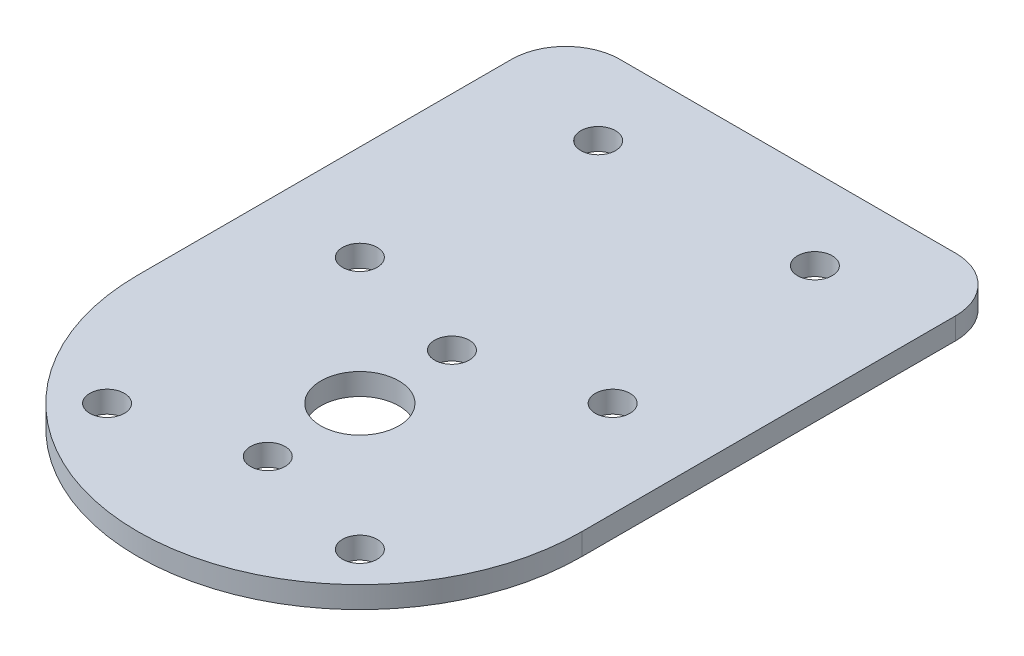
ISO-10303-21;
HEADER;
FILE_DESCRIPTION(('STEP AP214'),'2;1');
FILE_NAME('part.step','',(''),(''),'','','');
FILE_SCHEMA(('AUTOMOTIVE_DESIGN { 1 0 10303 214 1 1 1 1 }'));
ENDSEC;
DATA;
#1=APPLICATION_CONTEXT('core data for automotive mechanical design processes');
#2=APPLICATION_PROTOCOL_DEFINITION('international standard','automotive_design',2000,#1);
#3=PRODUCT_CONTEXT('',#1,'mechanical');
#4=PRODUCT('Part','Part','',(#3));
#5=PRODUCT_RELATED_PRODUCT_CATEGORY('part','',(#4));
#6=PRODUCT_DEFINITION_FORMATION('','',#4);
#7=PRODUCT_DEFINITION_CONTEXT('part definition',#1,'design');
#8=PRODUCT_DEFINITION('design','',#6,#7);
#9=PRODUCT_DEFINITION_SHAPE('','',#8);
#10=(LENGTH_UNIT() NAMED_UNIT(*) SI_UNIT(.MILLI.,.METRE.));
#11=(NAMED_UNIT(*) PLANE_ANGLE_UNIT() SI_UNIT($,.RADIAN.));
#12=(NAMED_UNIT(*) SI_UNIT($,.STERADIAN.) SOLID_ANGLE_UNIT());
#13=UNCERTAINTY_MEASURE_WITH_UNIT(LENGTH_MEASURE(1.E-05),#10,'distance_accuracy_value','');
#14=(GEOMETRIC_REPRESENTATION_CONTEXT(3) GLOBAL_UNCERTAINTY_ASSIGNED_CONTEXT((#13)) GLOBAL_UNIT_ASSIGNED_CONTEXT((#10,
#11,#12)) REPRESENTATION_CONTEXT('',''));
#15=CARTESIAN_POINT('',(0.,0.,0.));
#16=DIRECTION('',(0.,0.,1.));
#17=DIRECTION('',(1.,0.,0.));
#18=AXIS2_PLACEMENT_3D('',#15,#16,#17);
#19=CARTESIAN_POINT('',(-20.5,2.,0.));
#20=DIRECTION('',(-1.,0.,0.));
#21=DIRECTION('',(0.,0.,1.));
#22=AXIS2_PLACEMENT_3D('',#19,#20,#21);
#23=PLANE('',#22);
#24=DIRECTION('',(0.,0.,-1.));
#25=VECTOR('',#24,1.);
#26=CARTESIAN_POINT('',(-20.5,2.,0.));
#27=LINE('',#26,#25);
#28=CARTESIAN_POINT('',(-20.5,2.,0.));
#29=VERTEX_POINT('',#28);
#30=CARTESIAN_POINT('',(-20.5,2.,-34.5));
#31=VERTEX_POINT('',#30);
#32=EDGE_CURVE('E104',#29,#31,#27,.T.);
#33=ORIENTED_EDGE('',*,*,#32,.T.);
#34=DIRECTION('',(0.,-1.,0.));
#35=VECTOR('',#34,1.);
#36=CARTESIAN_POINT('',(-20.5,0.,-34.5));
#37=LINE('',#36,#35);
#38=CARTESIAN_POINT('',(-20.5,0.,-34.5));
#39=VERTEX_POINT('',#38);
#40=EDGE_CURVE('E11',#31,#39,#37,.T.);
#41=ORIENTED_EDGE('',*,*,#40,.T.);
#42=DIRECTION('',(0.,0.,-1.));
#43=VECTOR('',#42,1.);
#44=CARTESIAN_POINT('',(-20.5,0.,0.));
#45=LINE('',#44,#43);
#46=CARTESIAN_POINT('',(-20.5,0.,0.));
#47=VERTEX_POINT('',#46);
#48=EDGE_CURVE('E107',#47,#39,#45,.T.);
#49=ORIENTED_EDGE('',*,*,#48,.F.);
#50=DIRECTION('',(0.,-1.,0.));
#51=VECTOR('',#50,1.);
#52=CARTESIAN_POINT('',(-20.5,2.,0.));
#53=LINE('',#52,#51);
#54=EDGE_CURVE('E102',#29,#47,#53,.T.);
#55=ORIENTED_EDGE('',*,*,#54,.F.);
#56=EDGE_LOOP('',(#33,#41,#49,#55));
#57=FACE_BOUND('',#56,.T.);
#58=ADVANCED_FACE('F46',(#57),#23,.T.);
#59=CARTESIAN_POINT('',(0.,2.,0.));
#60=DIRECTION('',(0.,-1.,0.));
#61=DIRECTION('',(0.,0.,-1.));
#62=AXIS2_PLACEMENT_3D('',#59,#60,#61);
#63=CYLINDRICAL_SURFACE('',#62,20.5);
#64=CARTESIAN_POINT('',(0.,0.,0.));
#65=DIRECTION('',(0.,1.,0.));
#66=DIRECTION('',(0.,0.,1.));
#67=AXIS2_PLACEMENT_3D('',#64,#65,#66);
#68=CIRCLE('',#67,20.5);
#69=CARTESIAN_POINT('',(20.5,0.,0.));
#70=VERTEX_POINT('',#69);
#71=EDGE_CURVE('E177',#47,#70,#68,.T.);
#72=ORIENTED_EDGE('',*,*,#71,.T.);
#73=DIRECTION('',(0.,-1.,0.));
#74=VECTOR('',#73,1.);
#75=CARTESIAN_POINT('',(20.5,2.,0.));
#76=LINE('',#75,#74);
#77=CARTESIAN_POINT('',(20.5,2.,0.));
#78=VERTEX_POINT('',#77);
#79=EDGE_CURVE('E113',#78,#70,#76,.T.);
#80=ORIENTED_EDGE('',*,*,#79,.F.);
#81=CARTESIAN_POINT('',(0.,2.,0.));
#82=DIRECTION('',(0.,1.,0.));
#83=DIRECTION('',(0.,0.,1.));
#84=AXIS2_PLACEMENT_3D('',#81,#82,#83);
#85=CIRCLE('',#84,20.5);
#86=EDGE_CURVE('E117',#29,#78,#85,.T.);
#87=ORIENTED_EDGE('',*,*,#86,.F.);
#88=ORIENTED_EDGE('',*,*,#54,.T.);
#89=EDGE_LOOP('',(#72,#80,#87,#88));
#90=FACE_BOUND('',#89,.T.);
#91=ADVANCED_FACE('F118',(#90),#63,.T.);
#92=CARTESIAN_POINT('',(20.5,2.,0.));
#93=DIRECTION('',(-1.,0.,0.));
#94=DIRECTION('',(0.,0.,1.));
#95=AXIS2_PLACEMENT_3D('',#92,#93,#94);
#96=PLANE('',#95);
#97=DIRECTION('',(0.,0.,-1.));
#98=VECTOR('',#97,1.);
#99=CARTESIAN_POINT('',(20.5,0.,0.));
#100=LINE('',#99,#98);
#101=CARTESIAN_POINT('',(20.5,0.,-34.5));
#102=VERTEX_POINT('',#101);
#103=EDGE_CURVE('E180',#70,#102,#100,.T.);
#104=ORIENTED_EDGE('',*,*,#103,.T.);
#105=DIRECTION('',(0.,-1.,0.));
#106=VECTOR('',#105,1.);
#107=CARTESIAN_POINT('',(20.5,2.,-34.5));
#108=LINE('',#107,#106);
#109=CARTESIAN_POINT('',(20.5,2.,-34.5));
#110=VERTEX_POINT('',#109);
#111=EDGE_CURVE('E70',#102,#110,#108,.F.);
#112=ORIENTED_EDGE('',*,*,#111,.T.);
#113=DIRECTION('',(0.,0.,-1.));
#114=VECTOR('',#113,1.);
#115=CARTESIAN_POINT('',(20.5,2.,0.));
#116=LINE('',#115,#114);
#117=EDGE_CURVE('E121',#78,#110,#116,.T.);
#118=ORIENTED_EDGE('',*,*,#117,.F.);
#119=ORIENTED_EDGE('',*,*,#79,.T.);
#120=EDGE_LOOP('',(#104,#112,#118,#119));
#121=FACE_BOUND('',#120,.T.);
#122=ADVANCED_FACE('F245',(#121),#96,.F.);
#123=CARTESIAN_POINT('',(0.,2.,-8.5));
#124=DIRECTION('',(0.,-1.,0.));
#125=DIRECTION('',(0.,0.,-1.));
#126=AXIS2_PLACEMENT_3D('',#123,#124,#125);
#127=CYLINDRICAL_SURFACE('',#126,1.6);
#128=CARTESIAN_POINT('',(0.,2.,-8.5));
#129=DIRECTION('',(0.,1.,0.));
#130=DIRECTION('',(0.,0.,1.));
#131=AXIS2_PLACEMENT_3D('',#128,#129,#130);
#132=CIRCLE('',#131,1.6);
#133=CARTESIAN_POINT('',(0.,2.,-6.9));
#134=VERTEX_POINT('',#133);
#135=EDGE_CURVE('E159',#134,#134,#132,.T.);
#136=ORIENTED_EDGE('',*,*,#135,.T.);
#137=EDGE_LOOP('',(#136));
#138=FACE_BOUND('',#137,.T.);
#139=CARTESIAN_POINT('',(0.,0.,-8.5));
#140=DIRECTION('',(0.,1.,0.));
#141=DIRECTION('',(0.,0.,1.));
#142=AXIS2_PLACEMENT_3D('',#139,#140,#141);
#143=CIRCLE('',#142,1.6);
#144=CARTESIAN_POINT('',(0.,0.,-6.9));
#145=VERTEX_POINT('',#144);
#146=EDGE_CURVE('E207',#145,#145,#143,.T.);
#147=ORIENTED_EDGE('',*,*,#146,.F.);
#148=EDGE_LOOP('',(#147));
#149=FACE_BOUND('',#148,.T.);
#150=ADVANCED_FACE('F289',(#138,#149),#127,.F.);
#151=CARTESIAN_POINT('',(0.,2.,8.5));
#152=DIRECTION('',(0.,-1.,0.));
#153=DIRECTION('',(0.,0.,-1.));
#154=AXIS2_PLACEMENT_3D('',#151,#152,#153);
#155=CYLINDRICAL_SURFACE('',#154,1.6);
#156=CARTESIAN_POINT('',(0.,2.,8.5));
#157=DIRECTION('',(0.,1.,0.));
#158=DIRECTION('',(0.,0.,1.));
#159=AXIS2_PLACEMENT_3D('',#156,#157,#158);
#160=CIRCLE('',#159,1.6);
#161=CARTESIAN_POINT('',(0.,2.,10.1));
#162=VERTEX_POINT('',#161);
#163=EDGE_CURVE('E155',#162,#162,#160,.T.);
#164=ORIENTED_EDGE('',*,*,#163,.T.);
#165=EDGE_LOOP('',(#164));
#166=FACE_BOUND('',#165,.T.);
#167=CARTESIAN_POINT('',(0.,0.,8.5));
#168=DIRECTION('',(0.,1.,0.));
#169=DIRECTION('',(0.,0.,1.));
#170=AXIS2_PLACEMENT_3D('',#167,#168,#169);
#171=CIRCLE('',#170,1.6);
#172=CARTESIAN_POINT('',(0.,0.,10.1));
#173=VERTEX_POINT('',#172);
#174=EDGE_CURVE('E203',#173,#173,#171,.T.);
#175=ORIENTED_EDGE('',*,*,#174,.F.);
#176=EDGE_LOOP('',(#175));
#177=FACE_BOUND('',#176,.T.);
#178=ADVANCED_FACE('F292',(#166,#177),#155,.F.);
#179=CARTESIAN_POINT('',(-11.6672618895781,2.,11.667261889578));
#180=DIRECTION('',(0.,-1.,0.));
#181=DIRECTION('',(0.,0.,-1.));
#182=AXIS2_PLACEMENT_3D('',#179,#180,#181);
#183=CYLINDRICAL_SURFACE('',#182,1.6);
#184=CARTESIAN_POINT('',(-11.6672618895781,2.,11.667261889578));
#185=DIRECTION('',(0.,1.,0.));
#186=DIRECTION('',(0.,0.,1.));
#187=AXIS2_PLACEMENT_3D('',#184,#185,#186);
#188=CIRCLE('',#187,1.6);
#189=CARTESIAN_POINT('',(-11.6672618895781,2.,13.267261889578));
#190=VERTEX_POINT('',#189);
#191=EDGE_CURVE('E151',#190,#190,#188,.T.);
#192=ORIENTED_EDGE('',*,*,#191,.T.);
#193=EDGE_LOOP('',(#192));
#194=FACE_BOUND('',#193,.T.);
#195=CARTESIAN_POINT('',(-11.6672618895781,0.,11.667261889578));
#196=DIRECTION('',(0.,1.,0.));
#197=DIRECTION('',(0.,0.,1.));
#198=AXIS2_PLACEMENT_3D('',#195,#196,#197);
#199=CIRCLE('',#198,1.6);
#200=CARTESIAN_POINT('',(-11.6672618895781,0.,13.267261889578));
#201=VERTEX_POINT('',#200);
#202=EDGE_CURVE('E199',#201,#201,#199,.T.);
#203=ORIENTED_EDGE('',*,*,#202,.F.);
#204=EDGE_LOOP('',(#203));
#205=FACE_BOUND('',#204,.T.);
#206=ADVANCED_FACE('F296',(#194,#205),#183,.F.);
#207=CARTESIAN_POINT('',(-11.667261889578,2.,-11.6672618895781));
#208=DIRECTION('',(0.,-1.,0.));
#209=DIRECTION('',(0.,0.,-1.));
#210=AXIS2_PLACEMENT_3D('',#207,#208,#209);
#211=CYLINDRICAL_SURFACE('',#210,1.6);
#212=CARTESIAN_POINT('',(-11.667261889578,2.,-11.6672618895781));
#213=DIRECTION('',(0.,1.,0.));
#214=DIRECTION('',(0.,0.,1.));
#215=AXIS2_PLACEMENT_3D('',#212,#213,#214);
#216=CIRCLE('',#215,1.6);
#217=CARTESIAN_POINT('',(-11.667261889578,2.,-10.067261889578));
#218=VERTEX_POINT('',#217);
#219=EDGE_CURVE('E147',#218,#218,#216,.T.);
#220=ORIENTED_EDGE('',*,*,#219,.T.);
#221=EDGE_LOOP('',(#220));
#222=FACE_BOUND('',#221,.T.);
#223=CARTESIAN_POINT('',(-11.667261889578,0.,-11.6672618895781));
#224=DIRECTION('',(0.,1.,0.));
#225=DIRECTION('',(0.,0.,1.));
#226=AXIS2_PLACEMENT_3D('',#223,#224,#225);
#227=CIRCLE('',#226,1.6);
#228=CARTESIAN_POINT('',(-11.667261889578,0.,-10.067261889578));
#229=VERTEX_POINT('',#228);
#230=EDGE_CURVE('E195',#229,#229,#227,.T.);
#231=ORIENTED_EDGE('',*,*,#230,.F.);
#232=EDGE_LOOP('',(#231));
#233=FACE_BOUND('',#232,.T.);
#234=ADVANCED_FACE('F300',(#222,#233),#211,.F.);
#235=CARTESIAN_POINT('',(11.6672618895781,2.,-11.667261889578));
#236=DIRECTION('',(0.,-1.,0.));
#237=DIRECTION('',(0.,0.,-1.));
#238=AXIS2_PLACEMENT_3D('',#235,#236,#237);
#239=CYLINDRICAL_SURFACE('',#238,1.60000000000001);
#240=CARTESIAN_POINT('',(11.6672618895781,2.,-11.667261889578));
#241=DIRECTION('',(0.,1.,0.));
#242=DIRECTION('',(0.,0.,1.));
#243=AXIS2_PLACEMENT_3D('',#240,#241,#242);
#244=CIRCLE('',#243,1.60000000000001);
#245=CARTESIAN_POINT('',(11.6672618895781,2.,-10.067261889578));
#246=VERTEX_POINT('',#245);
#247=EDGE_CURVE('E143',#246,#246,#244,.T.);
#248=ORIENTED_EDGE('',*,*,#247,.T.);
#249=EDGE_LOOP('',(#248));
#250=FACE_BOUND('',#249,.T.);
#251=CARTESIAN_POINT('',(11.6672618895781,0.,-11.667261889578));
#252=DIRECTION('',(0.,1.,0.));
#253=DIRECTION('',(0.,0.,1.));
#254=AXIS2_PLACEMENT_3D('',#251,#252,#253);
#255=CIRCLE('',#254,1.60000000000001);
#256=CARTESIAN_POINT('',(11.6672618895781,0.,-10.067261889578));
#257=VERTEX_POINT('',#256);
#258=EDGE_CURVE('E191',#257,#257,#255,.T.);
#259=ORIENTED_EDGE('',*,*,#258,.F.);
#260=EDGE_LOOP('',(#259));
#261=FACE_BOUND('',#260,.T.);
#262=ADVANCED_FACE('F304',(#250,#261),#239,.F.);
#263=CARTESIAN_POINT('',(11.667261889578,2.,11.6672618895781));
#264=DIRECTION('',(0.,-1.,0.));
#265=DIRECTION('',(0.,0.,-1.));
#266=AXIS2_PLACEMENT_3D('',#263,#264,#265);
#267=CYLINDRICAL_SURFACE('',#266,1.6);
#268=CARTESIAN_POINT('',(11.667261889578,2.,11.6672618895781));
#269=DIRECTION('',(0.,1.,0.));
#270=DIRECTION('',(0.,0.,1.));
#271=AXIS2_PLACEMENT_3D('',#268,#269,#270);
#272=CIRCLE('',#271,1.6);
#273=CARTESIAN_POINT('',(11.667261889578,2.,13.2672618895781));
#274=VERTEX_POINT('',#273);
#275=EDGE_CURVE('E139',#274,#274,#272,.T.);
#276=ORIENTED_EDGE('',*,*,#275,.T.);
#277=EDGE_LOOP('',(#276));
#278=FACE_BOUND('',#277,.T.);
#279=CARTESIAN_POINT('',(11.667261889578,0.,11.6672618895781));
#280=DIRECTION('',(0.,1.,0.));
#281=DIRECTION('',(0.,0.,1.));
#282=AXIS2_PLACEMENT_3D('',#279,#280,#281);
#283=CIRCLE('',#282,1.6);
#284=CARTESIAN_POINT('',(11.667261889578,0.,13.2672618895781));
#285=VERTEX_POINT('',#284);
#286=EDGE_CURVE('E187',#285,#285,#283,.T.);
#287=ORIENTED_EDGE('',*,*,#286,.F.);
#288=EDGE_LOOP('',(#287));
#289=FACE_BOUND('',#288,.T.);
#290=ADVANCED_FACE('F308',(#278,#289),#267,.F.);
#291=CARTESIAN_POINT('',(0.,2.,-39.5));
#292=DIRECTION('',(0.,0.,1.));
#293=DIRECTION('',(1.,0.,0.));
#294=AXIS2_PLACEMENT_3D('',#291,#292,#293);
#295=PLANE('',#294);
#296=DIRECTION('',(-1.,0.,0.));
#297=VECTOR('',#296,1.);
#298=CARTESIAN_POINT('',(0.,2.,-39.5));
#299=LINE('',#298,#297);
#300=CARTESIAN_POINT('',(15.5,2.,-39.5));
#301=VERTEX_POINT('',#300);
#302=CARTESIAN_POINT('',(-15.5,2.,-39.5));
#303=VERTEX_POINT('',#302);
#304=EDGE_CURVE('E136',#301,#303,#299,.T.);
#305=ORIENTED_EDGE('',*,*,#304,.F.);
#306=DIRECTION('',(0.,-1.,0.));
#307=VECTOR('',#306,1.);
#308=CARTESIAN_POINT('',(15.5,2.,-39.5));
#309=LINE('',#308,#307);
#310=CARTESIAN_POINT('',(15.5,0.,-39.5));
#311=VERTEX_POINT('',#310);
#312=EDGE_CURVE('E219',#301,#311,#309,.T.);
#313=ORIENTED_EDGE('',*,*,#312,.T.);
#314=DIRECTION('',(-1.,0.,0.));
#315=VECTOR('',#314,1.);
#316=CARTESIAN_POINT('',(0.,0.,-39.5));
#317=LINE('',#316,#315);
#318=CARTESIAN_POINT('',(-15.5,0.,-39.5));
#319=VERTEX_POINT('',#318);
#320=EDGE_CURVE('E183',#311,#319,#317,.T.);
#321=ORIENTED_EDGE('',*,*,#320,.T.);
#322=DIRECTION('',(0.,-1.,0.));
#323=VECTOR('',#322,1.);
#324=CARTESIAN_POINT('',(-15.5,2.,-39.5));
#325=LINE('',#324,#323);
#326=EDGE_CURVE('E112',#319,#303,#325,.F.);
#327=ORIENTED_EDGE('',*,*,#326,.T.);
#328=EDGE_LOOP('',(#305,#313,#321,#327));
#329=FACE_BOUND('',#328,.T.);
#330=ADVANCED_FACE('F238',(#329),#295,.F.);
#331=CARTESIAN_POINT('',(-10.,2.,-32.));
#332=DIRECTION('',(0.,-1.,0.));
#333=DIRECTION('',(0.,0.,-1.));
#334=AXIS2_PLACEMENT_3D('',#331,#332,#333);
#335=CYLINDRICAL_SURFACE('',#334,1.6);
#336=CARTESIAN_POINT('',(-10.,2.,-32.));
#337=DIRECTION('',(0.,1.,0.));
#338=DIRECTION('',(0.,0.,1.));
#339=AXIS2_PLACEMENT_3D('',#336,#337,#338);
#340=CIRCLE('',#339,1.6);
#341=CARTESIAN_POINT('',(-10.,2.,-30.4));
#342=VERTEX_POINT('',#341);
#343=EDGE_CURVE('E126',#342,#342,#340,.T.);
#344=ORIENTED_EDGE('',*,*,#343,.T.);
#345=EDGE_LOOP('',(#344));
#346=FACE_BOUND('',#345,.T.);
#347=CARTESIAN_POINT('',(-10.,0.,-32.));
#348=DIRECTION('',(0.,1.,0.));
#349=DIRECTION('',(0.,0.,1.));
#350=AXIS2_PLACEMENT_3D('',#347,#348,#349);
#351=CIRCLE('',#350,1.6);
#352=CARTESIAN_POINT('',(-10.,0.,-30.4));
#353=VERTEX_POINT('',#352);
#354=EDGE_CURVE('E171',#353,#353,#351,.T.);
#355=ORIENTED_EDGE('',*,*,#354,.F.);
#356=EDGE_LOOP('',(#355));
#357=FACE_BOUND('',#356,.T.);
#358=ADVANCED_FACE('F261',(#346,#357),#335,.F.);
#359=CARTESIAN_POINT('',(10.,2.,-32.));
#360=DIRECTION('',(0.,-1.,0.));
#361=DIRECTION('',(0.,0.,-1.));
#362=AXIS2_PLACEMENT_3D('',#359,#360,#361);
#363=CYLINDRICAL_SURFACE('',#362,1.6);
#364=CARTESIAN_POINT('',(10.,2.,-32.));
#365=DIRECTION('',(0.,1.,0.));
#366=DIRECTION('',(0.,0.,1.));
#367=AXIS2_PLACEMENT_3D('',#364,#365,#366);
#368=CIRCLE('',#367,1.6);
#369=CARTESIAN_POINT('',(10.,2.,-30.4));
#370=VERTEX_POINT('',#369);
#371=EDGE_CURVE('E130',#370,#370,#368,.T.);
#372=ORIENTED_EDGE('',*,*,#371,.T.);
#373=EDGE_LOOP('',(#372));
#374=FACE_BOUND('',#373,.T.);
#375=CARTESIAN_POINT('',(10.,0.,-32.));
#376=DIRECTION('',(0.,1.,0.));
#377=DIRECTION('',(0.,0.,1.));
#378=AXIS2_PLACEMENT_3D('',#375,#376,#377);
#379=CIRCLE('',#378,1.6);
#380=CARTESIAN_POINT('',(10.,0.,-30.4));
#381=VERTEX_POINT('',#380);
#382=EDGE_CURVE('E167',#381,#381,#379,.T.);
#383=ORIENTED_EDGE('',*,*,#382,.F.);
#384=EDGE_LOOP('',(#383));
#385=FACE_BOUND('',#384,.T.);
#386=ADVANCED_FACE('F264',(#374,#385),#363,.F.);
#387=CARTESIAN_POINT('',(0.,2.,0.));
#388=DIRECTION('',(0.,-1.,0.));
#389=DIRECTION('',(0.,0.,-1.));
#390=AXIS2_PLACEMENT_3D('',#387,#388,#389);
#391=CYLINDRICAL_SURFACE('',#390,3.6);
#392=CARTESIAN_POINT('',(0.,2.,0.));
#393=DIRECTION('',(0.,1.,0.));
#394=DIRECTION('',(0.,0.,1.));
#395=AXIS2_PLACEMENT_3D('',#392,#393,#394);
#396=CIRCLE('',#395,3.6);
#397=CARTESIAN_POINT('',(0.,2.,3.6));
#398=VERTEX_POINT('',#397);
#399=EDGE_CURVE('E163',#398,#398,#396,.T.);
#400=ORIENTED_EDGE('',*,*,#399,.T.);
#401=EDGE_LOOP('',(#400));
#402=FACE_BOUND('',#401,.T.);
#403=CARTESIAN_POINT('',(0.,0.,0.));
#404=DIRECTION('',(0.,1.,0.));
#405=DIRECTION('',(0.,0.,1.));
#406=AXIS2_PLACEMENT_3D('',#403,#404,#405);
#407=CIRCLE('',#406,3.6);
#408=CARTESIAN_POINT('',(0.,0.,3.6));
#409=VERTEX_POINT('',#408);
#410=EDGE_CURVE('E211',#409,#409,#407,.T.);
#411=ORIENTED_EDGE('',*,*,#410,.F.);
#412=EDGE_LOOP('',(#411));
#413=FACE_BOUND('',#412,.T.);
#414=ADVANCED_FACE('F267',(#402,#413),#391,.F.);
#415=CARTESIAN_POINT('',(0.,2.,0.));
#416=DIRECTION('',(0.,1.,0.));
#417=DIRECTION('',(0.,0.,1.));
#418=AXIS2_PLACEMENT_3D('',#415,#416,#417);
#419=PLANE('',#418);
#420=ORIENTED_EDGE('',*,*,#371,.F.);
#421=EDGE_LOOP('',(#420));
#422=FACE_BOUND('',#421,.T.);
#423=ORIENTED_EDGE('',*,*,#343,.F.);
#424=EDGE_LOOP('',(#423));
#425=FACE_BOUND('',#424,.T.);
#426=ORIENTED_EDGE('',*,*,#117,.T.);
#427=CARTESIAN_POINT('',(15.5,2.,-34.5));
#428=DIRECTION('',(0.,1.,0.));
#429=DIRECTION('',(0.,0.,1.));
#430=AXIS2_PLACEMENT_3D('',#427,#428,#429);
#431=CIRCLE('',#430,5.);
#432=EDGE_CURVE('E55',#110,#301,#431,.T.);
#433=ORIENTED_EDGE('',*,*,#432,.T.);
#434=ORIENTED_EDGE('',*,*,#304,.T.);
#435=CARTESIAN_POINT('',(-15.5,2.,-34.5));
#436=DIRECTION('',(0.,1.,0.));
#437=DIRECTION('',(0.,0.,1.));
#438=AXIS2_PLACEMENT_3D('',#435,#436,#437);
#439=CIRCLE('',#438,5.);
#440=EDGE_CURVE('E62',#303,#31,#439,.T.);
#441=ORIENTED_EDGE('',*,*,#440,.T.);
#442=ORIENTED_EDGE('',*,*,#32,.F.);
#443=ORIENTED_EDGE('',*,*,#86,.T.);
#444=EDGE_LOOP('',(#426,#433,#434,#441,#442,#443));
#445=FACE_BOUND('',#444,.T.);
#446=ORIENTED_EDGE('',*,*,#275,.F.);
#447=EDGE_LOOP('',(#446));
#448=FACE_BOUND('',#447,.T.);
#449=ORIENTED_EDGE('',*,*,#247,.F.);
#450=EDGE_LOOP('',(#449));
#451=FACE_BOUND('',#450,.T.);
#452=ORIENTED_EDGE('',*,*,#219,.F.);
#453=EDGE_LOOP('',(#452));
#454=FACE_BOUND('',#453,.T.);
#455=ORIENTED_EDGE('',*,*,#191,.F.);
#456=EDGE_LOOP('',(#455));
#457=FACE_BOUND('',#456,.T.);
#458=ORIENTED_EDGE('',*,*,#163,.F.);
#459=EDGE_LOOP('',(#458));
#460=FACE_BOUND('',#459,.T.);
#461=ORIENTED_EDGE('',*,*,#135,.F.);
#462=EDGE_LOOP('',(#461));
#463=FACE_BOUND('',#462,.T.);
#464=ORIENTED_EDGE('',*,*,#399,.F.);
#465=EDGE_LOOP('',(#464));
#466=FACE_BOUND('',#465,.T.);
#467=ADVANCED_FACE('F123',(#422,#425,#445,#448,#451,#454,#457,#460,#463,#466),#419,.T.);
#468=CARTESIAN_POINT('',(0.,0.,0.));
#469=DIRECTION('',(0.,1.,0.));
#470=DIRECTION('',(0.,0.,1.));
#471=AXIS2_PLACEMENT_3D('',#468,#469,#470);
#472=PLANE('',#471);
#473=ORIENTED_EDGE('',*,*,#382,.T.);
#474=EDGE_LOOP('',(#473));
#475=FACE_BOUND('',#474,.T.);
#476=ORIENTED_EDGE('',*,*,#354,.T.);
#477=EDGE_LOOP('',(#476));
#478=FACE_BOUND('',#477,.T.);
#479=ORIENTED_EDGE('',*,*,#320,.F.);
#480=CARTESIAN_POINT('',(15.5,0.,-34.5));
#481=DIRECTION('',(0.,1.,0.));
#482=DIRECTION('',(0.,0.,1.));
#483=AXIS2_PLACEMENT_3D('',#480,#481,#482);
#484=CIRCLE('',#483,5.);
#485=EDGE_CURVE('E226',#311,#102,#484,.F.);
#486=ORIENTED_EDGE('',*,*,#485,.T.);
#487=ORIENTED_EDGE('',*,*,#103,.F.);
#488=ORIENTED_EDGE('',*,*,#71,.F.);
#489=ORIENTED_EDGE('',*,*,#48,.T.);
#490=CARTESIAN_POINT('',(-15.5,0.,-34.5));
#491=DIRECTION('',(0.,1.,0.));
#492=DIRECTION('',(0.,0.,1.));
#493=AXIS2_PLACEMENT_3D('',#490,#491,#492);
#494=CIRCLE('',#493,5.);
#495=EDGE_CURVE('E223',#39,#319,#494,.F.);
#496=ORIENTED_EDGE('',*,*,#495,.T.);
#497=EDGE_LOOP('',(#479,#486,#487,#488,#489,#496));
#498=FACE_BOUND('',#497,.T.);
#499=ORIENTED_EDGE('',*,*,#286,.T.);
#500=EDGE_LOOP('',(#499));
#501=FACE_BOUND('',#500,.T.);
#502=ORIENTED_EDGE('',*,*,#258,.T.);
#503=EDGE_LOOP('',(#502));
#504=FACE_BOUND('',#503,.T.);
#505=ORIENTED_EDGE('',*,*,#230,.T.);
#506=EDGE_LOOP('',(#505));
#507=FACE_BOUND('',#506,.T.);
#508=ORIENTED_EDGE('',*,*,#202,.T.);
#509=EDGE_LOOP('',(#508));
#510=FACE_BOUND('',#509,.T.);
#511=ORIENTED_EDGE('',*,*,#174,.T.);
#512=EDGE_LOOP('',(#511));
#513=FACE_BOUND('',#512,.T.);
#514=ORIENTED_EDGE('',*,*,#146,.T.);
#515=EDGE_LOOP('',(#514));
#516=FACE_BOUND('',#515,.T.);
#517=ORIENTED_EDGE('',*,*,#410,.T.);
#518=EDGE_LOOP('',(#517));
#519=FACE_BOUND('',#518,.T.);
#520=ADVANCED_FACE('F243',(#475,#478,#498,#501,#504,#507,#510,#513,#516,#519),#472,.F.);
#521=CARTESIAN_POINT('',(15.5,2.,-34.5));
#522=DIRECTION('',(0.,-1.,0.));
#523=DIRECTION('',(0.,0.,-1.));
#524=AXIS2_PLACEMENT_3D('',#521,#522,#523);
#525=CYLINDRICAL_SURFACE('',#524,5.);
#526=ORIENTED_EDGE('',*,*,#432,.F.);
#527=ORIENTED_EDGE('',*,*,#111,.F.);
#528=ORIENTED_EDGE('',*,*,#485,.F.);
#529=ORIENTED_EDGE('',*,*,#312,.F.);
#530=EDGE_LOOP('',(#526,#527,#528,#529));
#531=FACE_BOUND('',#530,.T.);
#532=ADVANCED_FACE('F241',(#531),#525,.T.);
#533=CARTESIAN_POINT('',(-15.5,2.,-34.5));
#534=DIRECTION('',(0.,1.,0.));
#535=DIRECTION('',(0.,0.,1.));
#536=AXIS2_PLACEMENT_3D('',#533,#534,#535);
#537=CYLINDRICAL_SURFACE('',#536,5.);
#538=ORIENTED_EDGE('',*,*,#440,.F.);
#539=ORIENTED_EDGE('',*,*,#326,.F.);
#540=ORIENTED_EDGE('',*,*,#495,.F.);
#541=ORIENTED_EDGE('',*,*,#40,.F.);
#542=EDGE_LOOP('',(#538,#539,#540,#541));
#543=FACE_BOUND('',#542,.T.);
#544=ADVANCED_FACE('F48',(#543),#537,.T.);
#545=CLOSED_SHELL('',(#58,#91,#122,#150,#178,#206,#234,#262,#290,#330,#358,#386,#414,#467,#520,
#532,#544));
#546=MANIFOLD_SOLID_BREP('B2',#545);
#547=ADVANCED_BREP_SHAPE_REPRESENTATION('',(#18,#546),#14);
#548=SHAPE_DEFINITION_REPRESENTATION(#9,#547);
ENDSEC;
END-ISO-10303-21;
